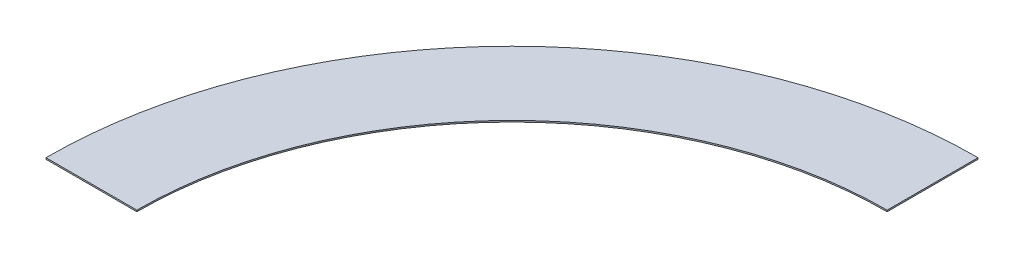
ISO-10303-21;
HEADER;
FILE_DESCRIPTION(('STEP AP214'),'2;1');
FILE_NAME('part.step','',(''),(''),'','','');
FILE_SCHEMA(('AUTOMOTIVE_DESIGN { 1 0 10303 214 1 1 1 1 }'));
ENDSEC;
DATA;
#1=APPLICATION_CONTEXT('core data for automotive mechanical design processes');
#2=APPLICATION_PROTOCOL_DEFINITION('international standard','automotive_design',2000,#1);
#3=PRODUCT_CONTEXT('',#1,'mechanical');
#4=PRODUCT('Part','Part','',(#3));
#5=PRODUCT_RELATED_PRODUCT_CATEGORY('part','',(#4));
#6=PRODUCT_DEFINITION_FORMATION('','',#4);
#7=PRODUCT_DEFINITION_CONTEXT('part definition',#1,'design');
#8=PRODUCT_DEFINITION('design','',#6,#7);
#9=PRODUCT_DEFINITION_SHAPE('','',#8);
#10=(LENGTH_UNIT() NAMED_UNIT(*) SI_UNIT(.MILLI.,.METRE.));
#11=(NAMED_UNIT(*) PLANE_ANGLE_UNIT() SI_UNIT($,.RADIAN.));
#12=(NAMED_UNIT(*) SI_UNIT($,.STERADIAN.) SOLID_ANGLE_UNIT());
#13=UNCERTAINTY_MEASURE_WITH_UNIT(LENGTH_MEASURE(1.E-05),#10,'distance_accuracy_value','');
#14=(GEOMETRIC_REPRESENTATION_CONTEXT(3) GLOBAL_UNCERTAINTY_ASSIGNED_CONTEXT((#13)) GLOBAL_UNIT_ASSIGNED_CONTEXT((#10,
#11,#12)) REPRESENTATION_CONTEXT('',''));
#15=CARTESIAN_POINT('',(0.,0.,0.));
#16=DIRECTION('',(0.,0.,1.));
#17=DIRECTION('',(1.,0.,0.));
#18=AXIS2_PLACEMENT_3D('',#15,#16,#17);
#19=CARTESIAN_POINT('',(1.22124532708767E-12,2986.,1.22124532708767E-12));
#20=DIRECTION('',(0.,1.,0.));
#21=DIRECTION('',(0.,0.,1.));
#22=AXIS2_PLACEMENT_3D('',#19,#20,#21);
#23=CYLINDRICAL_SURFACE('',#22,969.500000000001);
#24=CARTESIAN_POINT('',(1.22124532708767E-12,2989.,1.22124532708767E-12));
#25=DIRECTION('',(0.,1.,0.));
#26=DIRECTION('',(0.,0.,-1.));
#27=AXIS2_PLACEMENT_3D('',#24,#25,#26);
#28=CIRCLE('',#27,969.500000000001);
#29=CARTESIAN_POINT('',(0.,2989.,-969.5));
#30=VERTEX_POINT('',#29);
#31=CARTESIAN_POINT('',(-969.5,2989.,1.18729507177336E-13));
#32=VERTEX_POINT('',#31);
#33=EDGE_CURVE('E100',#30,#32,#28,.T.);
#34=ORIENTED_EDGE('',*,*,#33,.F.);
#35=DIRECTION('',(0.,1.,0.));
#36=VECTOR('',#35,1.);
#37=CARTESIAN_POINT('',(0.,2986.,-969.5));
#38=LINE('',#37,#36);
#39=CARTESIAN_POINT('',(0.,2986.,-969.5));
#40=VERTEX_POINT('',#39);
#41=EDGE_CURVE('E11',#40,#30,#38,.T.);
#42=ORIENTED_EDGE('',*,*,#41,.F.);
#43=CARTESIAN_POINT('',(1.22124532708767E-12,2986.,1.22124532708767E-12));
#44=DIRECTION('',(0.,1.,0.));
#45=DIRECTION('',(0.,0.,-1.));
#46=AXIS2_PLACEMENT_3D('',#43,#44,#45);
#47=CIRCLE('',#46,969.500000000001);
#48=CARTESIAN_POINT('',(-969.5,2986.,1.18729507177336E-13));
#49=VERTEX_POINT('',#48);
#50=EDGE_CURVE('E94',#40,#49,#47,.T.);
#51=ORIENTED_EDGE('',*,*,#50,.T.);
#52=DIRECTION('',(0.,1.,0.));
#53=VECTOR('',#52,1.);
#54=CARTESIAN_POINT('',(-969.5,2986.,1.18729507177336E-13));
#55=LINE('',#54,#53);
#56=EDGE_CURVE('E39',#49,#32,#55,.T.);
#57=ORIENTED_EDGE('',*,*,#56,.T.);
#58=EDGE_LOOP('',(#34,#42,#51,#57));
#59=FACE_BOUND('',#58,.T.);
#60=ADVANCED_FACE('F36',(#59),#23,.T.);
#61=CARTESIAN_POINT('',(0.,2986.,-969.5));
#62=DIRECTION('',(1.,0.,0.));
#63=DIRECTION('',(0.,0.,-1.));
#64=AXIS2_PLACEMENT_3D('',#61,#62,#63);
#65=PLANE('',#64);
#66=DIRECTION('',(0.,0.,-1.));
#67=VECTOR('',#66,1.);
#68=CARTESIAN_POINT('',(0.,2989.,-969.5));
#69=LINE('',#68,#67);
#70=CARTESIAN_POINT('',(0.,2989.,-780.5));
#71=VERTEX_POINT('',#70);
#72=EDGE_CURVE('E96',#71,#30,#69,.T.);
#73=ORIENTED_EDGE('',*,*,#72,.F.);
#74=DIRECTION('',(0.,1.,0.));
#75=VECTOR('',#74,1.);
#76=CARTESIAN_POINT('',(0.,2986.,-780.5));
#77=LINE('',#76,#75);
#78=CARTESIAN_POINT('',(0.,2986.,-780.5));
#79=VERTEX_POINT('',#78);
#80=EDGE_CURVE('E45',#79,#71,#77,.T.);
#81=ORIENTED_EDGE('',*,*,#80,.F.);
#82=DIRECTION('',(0.,0.,-1.));
#83=VECTOR('',#82,1.);
#84=CARTESIAN_POINT('',(0.,2986.,-969.5));
#85=LINE('',#84,#83);
#86=EDGE_CURVE('E91',#79,#40,#85,.T.);
#87=ORIENTED_EDGE('',*,*,#86,.T.);
#88=ORIENTED_EDGE('',*,*,#41,.T.);
#89=EDGE_LOOP('',(#73,#81,#87,#88));
#90=FACE_BOUND('',#89,.T.);
#91=ADVANCED_FACE('F110',(#90),#65,.T.);
#92=CARTESIAN_POINT('',(1.22124532708767E-12,2986.,1.33489935737077E-12));
#93=DIRECTION('',(0.,1.,0.));
#94=DIRECTION('',(0.,0.,1.));
#95=AXIS2_PLACEMENT_3D('',#92,#93,#94);
#96=CYLINDRICAL_SURFACE('',#95,780.500000000001);
#97=CARTESIAN_POINT('',(1.22124532708767E-12,2989.,1.33489935737077E-12));
#98=DIRECTION('',(0.,-1.,0.));
#99=DIRECTION('',(0.,0.,-1.));
#100=AXIS2_PLACEMENT_3D('',#97,#98,#99);
#101=CIRCLE('',#100,780.500000000001);
#102=CARTESIAN_POINT('',(-780.5,2989.,0.));
#103=VERTEX_POINT('',#102);
#104=EDGE_CURVE('E86',#103,#71,#101,.T.);
#105=ORIENTED_EDGE('',*,*,#104,.F.);
#106=DIRECTION('',(0.,1.,0.));
#107=VECTOR('',#106,1.);
#108=CARTESIAN_POINT('',(-780.5,2986.,0.));
#109=LINE('',#108,#107);
#110=CARTESIAN_POINT('',(-780.5,2986.,0.));
#111=VERTEX_POINT('',#110);
#112=EDGE_CURVE('E81',#111,#103,#109,.T.);
#113=ORIENTED_EDGE('',*,*,#112,.F.);
#114=CARTESIAN_POINT('',(1.22124532708767E-12,2986.,1.33489935737077E-12));
#115=DIRECTION('',(0.,-1.,0.));
#116=DIRECTION('',(0.,0.,-1.));
#117=AXIS2_PLACEMENT_3D('',#114,#115,#116);
#118=CIRCLE('',#117,780.500000000001);
#119=EDGE_CURVE('E84',#111,#79,#118,.T.);
#120=ORIENTED_EDGE('',*,*,#119,.T.);
#121=ORIENTED_EDGE('',*,*,#80,.T.);
#122=EDGE_LOOP('',(#105,#113,#120,#121));
#123=FACE_BOUND('',#122,.T.);
#124=ADVANCED_FACE('F83',(#123),#96,.F.);
#125=CARTESIAN_POINT('',(-780.5,2986.,0.));
#126=DIRECTION('',(0.,0.,1.));
#127=DIRECTION('',(1.,0.,0.));
#128=AXIS2_PLACEMENT_3D('',#125,#126,#127);
#129=PLANE('',#128);
#130=DIRECTION('',(1.,0.,0.));
#131=VECTOR('',#130,1.);
#132=CARTESIAN_POINT('',(-780.5,2989.,0.));
#133=LINE('',#132,#131);
#134=EDGE_CURVE('E103',#32,#103,#133,.T.);
#135=ORIENTED_EDGE('',*,*,#134,.F.);
#136=ORIENTED_EDGE('',*,*,#56,.F.);
#137=DIRECTION('',(1.,0.,0.));
#138=VECTOR('',#137,1.);
#139=CARTESIAN_POINT('',(-780.5,2986.,0.));
#140=LINE('',#139,#138);
#141=EDGE_CURVE('E90',#49,#111,#140,.T.);
#142=ORIENTED_EDGE('',*,*,#141,.T.);
#143=ORIENTED_EDGE('',*,*,#112,.T.);
#144=EDGE_LOOP('',(#135,#136,#142,#143));
#145=FACE_BOUND('',#144,.T.);
#146=ADVANCED_FACE('F93',(#145),#129,.T.);
#147=CARTESIAN_POINT('',(1.22124532708767E-12,2986.,1.22124532708767E-12));
#148=DIRECTION('',(0.,-1.,0.));
#149=DIRECTION('',(0.,0.,-1.));
#150=AXIS2_PLACEMENT_3D('',#147,#148,#149);
#151=PLANE('',#150);
#152=ORIENTED_EDGE('',*,*,#50,.F.);
#153=ORIENTED_EDGE('',*,*,#86,.F.);
#154=ORIENTED_EDGE('',*,*,#119,.F.);
#155=ORIENTED_EDGE('',*,*,#141,.F.);
#156=EDGE_LOOP('',(#152,#153,#154,#155));
#157=FACE_BOUND('',#156,.T.);
#158=ADVANCED_FACE('F89',(#157),#151,.T.);
#159=CARTESIAN_POINT('',(1.22124532708767E-12,2989.,1.22124532708767E-12));
#160=DIRECTION('',(0.,-1.,0.));
#161=DIRECTION('',(0.,0.,-1.));
#162=AXIS2_PLACEMENT_3D('',#159,#160,#161);
#163=PLANE('',#162);
#164=ORIENTED_EDGE('',*,*,#33,.T.);
#165=ORIENTED_EDGE('',*,*,#134,.T.);
#166=ORIENTED_EDGE('',*,*,#104,.T.);
#167=ORIENTED_EDGE('',*,*,#72,.T.);
#168=EDGE_LOOP('',(#164,#165,#166,#167));
#169=FACE_BOUND('',#168,.T.);
#170=ADVANCED_FACE('F109',(#169),#163,.F.);
#171=CLOSED_SHELL('',(#60,#91,#124,#146,#158,#170));
#172=MANIFOLD_SOLID_BREP('B2',#171);
#173=ADVANCED_BREP_SHAPE_REPRESENTATION('',(#18,#172),#14);
#174=SHAPE_DEFINITION_REPRESENTATION(#9,#173);
ENDSEC;
END-ISO-10303-21;
